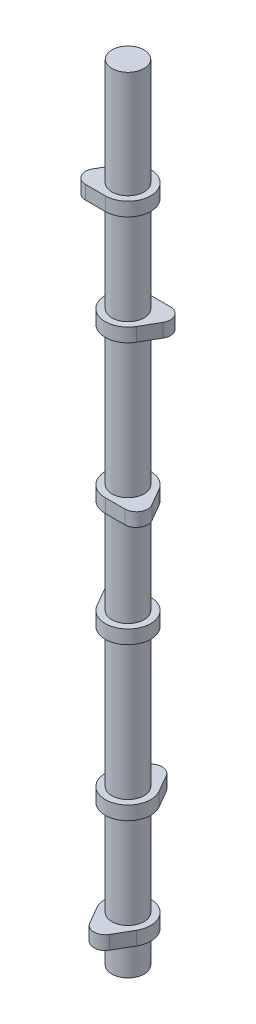
ISO-10303-21;
HEADER;
FILE_DESCRIPTION(('STEP AP214'),'2;1');
FILE_NAME('part.step','',(''),(''),'','','');
FILE_SCHEMA(('AUTOMOTIVE_DESIGN { 1 0 10303 214 1 1 1 1 }'));
ENDSEC;
DATA;
#1=APPLICATION_CONTEXT('core data for automotive mechanical design processes');
#2=APPLICATION_PROTOCOL_DEFINITION('international standard','automotive_design',2000,#1);
#3=PRODUCT_CONTEXT('',#1,'mechanical');
#4=PRODUCT('Part','Part','',(#3));
#5=PRODUCT_RELATED_PRODUCT_CATEGORY('part','',(#4));
#6=PRODUCT_DEFINITION_FORMATION('','',#4);
#7=PRODUCT_DEFINITION_CONTEXT('part definition',#1,'design');
#8=PRODUCT_DEFINITION('design','',#6,#7);
#9=PRODUCT_DEFINITION_SHAPE('','',#8);
#10=(LENGTH_UNIT() NAMED_UNIT(*) SI_UNIT(.MILLI.,.METRE.));
#11=(NAMED_UNIT(*) PLANE_ANGLE_UNIT() SI_UNIT($,.RADIAN.));
#12=(NAMED_UNIT(*) SI_UNIT($,.STERADIAN.) SOLID_ANGLE_UNIT());
#13=UNCERTAINTY_MEASURE_WITH_UNIT(LENGTH_MEASURE(1.E-05),#10,'distance_accuracy_value','');
#14=(GEOMETRIC_REPRESENTATION_CONTEXT(3) GLOBAL_UNCERTAINTY_ASSIGNED_CONTEXT((#13)) GLOBAL_UNIT_ASSIGNED_CONTEXT((#10,
#11,#12)) REPRESENTATION_CONTEXT('',''));
#15=CARTESIAN_POINT('',(0.,0.,0.));
#16=DIRECTION('',(0.,0.,1.));
#17=DIRECTION('',(1.,0.,0.));
#18=AXIS2_PLACEMENT_3D('',#15,#16,#17);
#19=CARTESIAN_POINT('',(-10.9985226280625,360.62,6.34999999999982));
#20=DIRECTION('',(0.,-1.,0.));
#21=DIRECTION('',(0.866025403784447,0.,-0.499999999999986));
#22=AXIS2_PLACEMENT_3D('',#19,#20,#21);
#23=CYLINDRICAL_SURFACE('',#22,6.35);
#24=CARTESIAN_POINT('',(-10.9985226280625,353.,6.34999999999982));
#25=DIRECTION('',(0.,1.,0.));
#26=DIRECTION('',(-0.866025403784447,0.,0.499999999999986));
#27=AXIS2_PLACEMENT_3D('',#24,#25,#26);
#28=CIRCLE('',#27,6.35);
#29=CARTESIAN_POINT('',(-16.4977839420936,353.,3.17499999999973));
#30=VERTEX_POINT('',#29);
#31=CARTESIAN_POINT('',(-10.9985226280626,353.,12.6999999999998));
#32=VERTEX_POINT('',#31);
#33=EDGE_CURVE('E466',#30,#32,#28,.T.);
#34=ORIENTED_EDGE('',*,*,#33,.T.);
#35=DIRECTION('',(0.,-1.,0.));
#36=VECTOR('',#35,1.);
#37=CARTESIAN_POINT('',(-10.9985226280626,360.62,12.6999999999998));
#38=LINE('',#37,#36);
#39=CARTESIAN_POINT('',(-10.9985226280626,360.62,12.6999999999998));
#40=VERTEX_POINT('',#39);
#41=EDGE_CURVE('E496',#40,#32,#38,.T.);
#42=ORIENTED_EDGE('',*,*,#41,.F.);
#43=CARTESIAN_POINT('',(-10.9985226280625,360.62,6.34999999999982));
#44=DIRECTION('',(0.,1.,0.));
#45=DIRECTION('',(-0.866025403784447,0.,0.499999999999986));
#46=AXIS2_PLACEMENT_3D('',#43,#44,#45);
#47=CIRCLE('',#46,6.35);
#48=CARTESIAN_POINT('',(-16.4977839420936,360.62,3.17499999999973));
#49=VERTEX_POINT('',#48);
#50=EDGE_CURVE('E467',#49,#40,#47,.T.);
#51=ORIENTED_EDGE('',*,*,#50,.F.);
#52=DIRECTION('',(0.,-1.,0.));
#53=VECTOR('',#52,1.);
#54=CARTESIAN_POINT('',(-16.4977839420936,360.62,3.17499999999973));
#55=LINE('',#54,#53);
#56=EDGE_CURVE('E477',#49,#30,#55,.T.);
#57=ORIENTED_EDGE('',*,*,#56,.T.);
#58=EDGE_LOOP('',(#34,#42,#51,#57));
#59=FACE_BOUND('',#58,.T.);
#60=ADVANCED_FACE('F47',(#59),#23,.T.);
#61=CARTESIAN_POINT('',(-10.9985226280626,360.62,12.6999999999998));
#62=DIRECTION('',(0.,0.,-1.));
#63=DIRECTION('',(-1.,0.,0.));
#64=AXIS2_PLACEMENT_3D('',#61,#62,#63);
#65=PLANE('',#64);
#66=DIRECTION('',(1.,0.,0.));
#67=VECTOR('',#66,1.);
#68=CARTESIAN_POINT('',(-10.9985226280626,353.,12.6999999999998));
#69=LINE('',#68,#67);
#70=CARTESIAN_POINT('',(-2.09034178855205E-13,353.,12.7));
#71=VERTEX_POINT('',#70);
#72=EDGE_CURVE('E481',#32,#71,#69,.T.);
#73=ORIENTED_EDGE('',*,*,#72,.T.);
#74=DIRECTION('',(0.,-1.,0.));
#75=VECTOR('',#74,1.);
#76=CARTESIAN_POINT('',(-2.09034178855205E-13,360.62,12.7));
#77=LINE('',#76,#75);
#78=CARTESIAN_POINT('',(-2.09034178855205E-13,360.62,12.7));
#79=VERTEX_POINT('',#78);
#80=EDGE_CURVE('E493',#79,#71,#77,.T.);
#81=ORIENTED_EDGE('',*,*,#80,.F.);
#82=DIRECTION('',(1.,0.,0.));
#83=VECTOR('',#82,1.);
#84=CARTESIAN_POINT('',(-10.9985226280626,360.62,12.6999999999998));
#85=LINE('',#84,#83);
#86=EDGE_CURVE('E97',#40,#79,#85,.T.);
#87=ORIENTED_EDGE('',*,*,#86,.F.);
#88=ORIENTED_EDGE('',*,*,#41,.T.);
#89=EDGE_LOOP('',(#73,#81,#87,#88));
#90=FACE_BOUND('',#89,.T.);
#91=ADVANCED_FACE('F517',(#90),#65,.F.);
#92=CARTESIAN_POINT('',(0.,360.62,0.));
#93=DIRECTION('',(0.,-1.,0.));
#94=DIRECTION('',(0.866025403784447,0.,-0.499999999999986));
#95=AXIS2_PLACEMENT_3D('',#92,#93,#94);
#96=CYLINDRICAL_SURFACE('',#95,12.7);
#97=CARTESIAN_POINT('',(0.,353.,0.));
#98=DIRECTION('',(0.,1.,0.));
#99=DIRECTION('',(-0.866025403784447,0.,0.499999999999986));
#100=AXIS2_PLACEMENT_3D('',#97,#98,#99);
#101=CIRCLE('',#100,12.7);
#102=CARTESIAN_POINT('',(-10.9985226280623,353.,-6.35000000000018));
#103=VERTEX_POINT('',#102);
#104=EDGE_CURVE('E83',#71,#103,#101,.T.);
#105=ORIENTED_EDGE('',*,*,#104,.T.);
#106=DIRECTION('',(0.,-1.,0.));
#107=VECTOR('',#106,1.);
#108=CARTESIAN_POINT('',(-10.9985226280623,360.62,-6.35000000000018));
#109=LINE('',#108,#107);
#110=CARTESIAN_POINT('',(-10.9985226280623,360.62,-6.35000000000018));
#111=VERTEX_POINT('',#110);
#112=EDGE_CURVE('E490',#111,#103,#109,.T.);
#113=ORIENTED_EDGE('',*,*,#112,.F.);
#114=CARTESIAN_POINT('',(0.,360.62,0.));
#115=DIRECTION('',(0.,1.,0.));
#116=DIRECTION('',(-0.866025403784447,0.,0.499999999999986));
#117=AXIS2_PLACEMENT_3D('',#114,#115,#116);
#118=CIRCLE('',#117,12.7);
#119=EDGE_CURVE('E472',#79,#111,#118,.T.);
#120=ORIENTED_EDGE('',*,*,#119,.F.);
#121=ORIENTED_EDGE('',*,*,#80,.T.);
#122=EDGE_LOOP('',(#105,#113,#120,#121));
#123=FACE_BOUND('',#122,.T.);
#124=ADVANCED_FACE('F516',(#123),#96,.T.);
#125=CARTESIAN_POINT('',(-16.4977839420936,360.62,3.17499999999973));
#126=DIRECTION('',(0.86602540378443,0.,0.500000000000014));
#127=DIRECTION('',(0.500000000000014,0.,-0.86602540378443));
#128=AXIS2_PLACEMENT_3D('',#125,#126,#127);
#129=PLANE('',#128);
#130=DIRECTION('',(-0.500000000000014,0.,0.86602540378443));
#131=VECTOR('',#130,1.);
#132=CARTESIAN_POINT('',(-16.4977839420936,353.,3.17499999999973));
#133=LINE('',#132,#131);
#134=EDGE_CURVE('E89',#103,#30,#133,.T.);
#135=ORIENTED_EDGE('',*,*,#134,.T.);
#136=ORIENTED_EDGE('',*,*,#56,.F.);
#137=DIRECTION('',(-0.500000000000014,0.,0.86602540378443));
#138=VECTOR('',#137,1.);
#139=CARTESIAN_POINT('',(-16.4977839420936,360.62,3.17499999999973));
#140=LINE('',#139,#138);
#141=EDGE_CURVE('E65',#111,#49,#140,.T.);
#142=ORIENTED_EDGE('',*,*,#141,.F.);
#143=ORIENTED_EDGE('',*,*,#112,.T.);
#144=EDGE_LOOP('',(#135,#136,#142,#143));
#145=FACE_BOUND('',#144,.T.);
#146=ADVANCED_FACE('F514',(#145),#129,.F.);
#147=CARTESIAN_POINT('',(-10.9985226280625,360.62,6.34999999999982));
#148=DIRECTION('',(0.,1.,0.));
#149=DIRECTION('',(-0.866025403784447,0.,0.499999999999986));
#150=AXIS2_PLACEMENT_3D('',#147,#148,#149);
#151=PLANE('',#150);
#152=CARTESIAN_POINT('',(0.,360.62,0.));
#153=DIRECTION('',(0.,1.,0.));
#154=DIRECTION('',(0.866025403784443,0.,-0.499999999999992));
#155=AXIS2_PLACEMENT_3D('',#152,#153,#154);
#156=CIRCLE('',#155,9.);
#157=CARTESIAN_POINT('',(7.79422863405999,360.62,-4.49999999999993));
#158=VERTEX_POINT('',#157);
#159=EDGE_CURVE('E462',#158,#158,#156,.F.);
#160=ORIENTED_EDGE('',*,*,#159,.T.);
#161=EDGE_LOOP('',(#160));
#162=FACE_BOUND('',#161,.T.);
#163=ORIENTED_EDGE('',*,*,#50,.T.);
#164=ORIENTED_EDGE('',*,*,#86,.T.);
#165=ORIENTED_EDGE('',*,*,#119,.T.);
#166=ORIENTED_EDGE('',*,*,#141,.T.);
#167=EDGE_LOOP('',(#163,#164,#165,#166));
#168=FACE_BOUND('',#167,.T.);
#169=ADVANCED_FACE('F508',(#162,#168),#151,.T.);
#170=CARTESIAN_POINT('',(-10.9985226280625,353.,6.34999999999982));
#171=DIRECTION('',(0.,1.,0.));
#172=DIRECTION('',(-0.866025403784447,0.,0.499999999999986));
#173=AXIS2_PLACEMENT_3D('',#170,#171,#172);
#174=PLANE('',#173);
#175=CARTESIAN_POINT('',(0.,353.,0.));
#176=DIRECTION('',(0.,1.,0.));
#177=DIRECTION('',(0.866025403784443,0.,-0.499999999999992));
#178=AXIS2_PLACEMENT_3D('',#175,#176,#177);
#179=CIRCLE('',#178,9.);
#180=CARTESIAN_POINT('',(7.79422863405999,353.,-4.49999999999993));
#181=VERTEX_POINT('',#180);
#182=EDGE_CURVE('E57',#181,#181,#179,.F.);
#183=ORIENTED_EDGE('',*,*,#182,.F.);
#184=EDGE_LOOP('',(#183));
#185=FACE_BOUND('',#184,.T.);
#186=ORIENTED_EDGE('',*,*,#33,.F.);
#187=ORIENTED_EDGE('',*,*,#134,.F.);
#188=ORIENTED_EDGE('',*,*,#104,.F.);
#189=ORIENTED_EDGE('',*,*,#72,.F.);
#190=EDGE_LOOP('',(#186,#187,#188,#189));
#191=FACE_BOUND('',#190,.T.);
#192=ADVANCED_FACE('F505',(#185,#191),#174,.F.);
#193=CARTESIAN_POINT('',(0.,420.37,0.));
#194=DIRECTION('',(0.,-1.,0.));
#195=DIRECTION('',(-0.866025403784443,0.,0.499999999999992));
#196=AXIS2_PLACEMENT_3D('',#193,#194,#195);
#197=CYLINDRICAL_SURFACE('',#196,9.);
#198=CARTESIAN_POINT('',(0.,299.72,0.));
#199=DIRECTION('',(0.,1.,0.));
#200=DIRECTION('',(0.866025403784443,0.,-0.499999999999992));
#201=AXIS2_PLACEMENT_3D('',#198,#199,#200);
#202=CIRCLE('',#201,9.);
#203=CARTESIAN_POINT('',(7.79422863405999,299.72,-4.49999999999993));
#204=VERTEX_POINT('',#203);
#205=EDGE_CURVE('E50',#204,#204,#202,.T.);
#206=ORIENTED_EDGE('',*,*,#205,.T.);
#207=EDGE_LOOP('',(#206));
#208=FACE_BOUND('',#207,.T.);
#209=ORIENTED_EDGE('',*,*,#182,.T.);
#210=EDGE_LOOP('',(#209));
#211=FACE_BOUND('',#210,.T.);
#212=ADVANCED_FACE('F503',(#208,#211),#197,.T.);
#213=ORIENTED_EDGE('',*,*,#159,.F.);
#214=EDGE_LOOP('',(#213));
#215=FACE_BOUND('',#214,.T.);
#216=CARTESIAN_POINT('',(0.,420.37,0.));
#217=DIRECTION('',(0.,1.,0.));
#218=DIRECTION('',(0.866025403784443,0.,-0.499999999999992));
#219=AXIS2_PLACEMENT_3D('',#216,#217,#218);
#220=CIRCLE('',#219,9.);
#221=CARTESIAN_POINT('',(7.79422863405999,420.37,-4.49999999999993));
#222=VERTEX_POINT('',#221);
#223=EDGE_CURVE('E458',#222,#222,#220,.T.);
#224=ORIENTED_EDGE('',*,*,#223,.F.);
#225=EDGE_LOOP('',(#224));
#226=FACE_BOUND('',#225,.T.);
#227=ADVANCED_FACE('F531',(#215,#226),#197,.T.);
#228=CARTESIAN_POINT('',(0.,420.37,0.));
#229=DIRECTION('',(0.,1.,0.));
#230=DIRECTION('',(0.866025403784443,0.,-0.499999999999992));
#231=AXIS2_PLACEMENT_3D('',#228,#229,#230);
#232=PLANE('',#231);
#233=ORIENTED_EDGE('',*,*,#223,.T.);
#234=EDGE_LOOP('',(#233));
#235=FACE_BOUND('',#234,.T.);
#236=ADVANCED_FACE('F534',(#235),#232,.T.);
#237=CARTESIAN_POINT('',(10.9985226280624,299.72,-6.3499999999999));
#238=DIRECTION('',(0.,-1.,0.));
#239=DIRECTION('',(-0.866025403784443,0.,0.499999999999992));
#240=AXIS2_PLACEMENT_3D('',#237,#238,#239);
#241=CYLINDRICAL_SURFACE('',#240,6.35);
#242=CARTESIAN_POINT('',(10.9985226280624,292.1,-6.3499999999999));
#243=DIRECTION('',(0.,1.,0.));
#244=DIRECTION('',(0.866025403784443,0.,-0.499999999999992));
#245=AXIS2_PLACEMENT_3D('',#242,#243,#244);
#246=CIRCLE('',#245,6.35);
#247=CARTESIAN_POINT('',(16.4977839420936,292.1,-3.17499999999985));
#248=VERTEX_POINT('',#247);
#249=CARTESIAN_POINT('',(10.9985226280625,292.1,-12.6999999999999));
#250=VERTEX_POINT('',#249);
#251=EDGE_CURVE('E413',#248,#250,#246,.T.);
#252=ORIENTED_EDGE('',*,*,#251,.T.);
#253=DIRECTION('',(0.,-1.,0.));
#254=VECTOR('',#253,1.);
#255=CARTESIAN_POINT('',(10.9985226280625,299.72,-12.6999999999999));
#256=LINE('',#255,#254);
#257=CARTESIAN_POINT('',(10.9985226280625,299.72,-12.6999999999999));
#258=VERTEX_POINT('',#257);
#259=EDGE_CURVE('E454',#258,#250,#256,.T.);
#260=ORIENTED_EDGE('',*,*,#259,.F.);
#261=CARTESIAN_POINT('',(10.9985226280624,299.72,-6.3499999999999));
#262=DIRECTION('',(0.,1.,0.));
#263=DIRECTION('',(0.866025403784443,0.,-0.499999999999992));
#264=AXIS2_PLACEMENT_3D('',#261,#262,#263);
#265=CIRCLE('',#264,6.35);
#266=CARTESIAN_POINT('',(16.4977839420936,299.72,-3.17499999999985));
#267=VERTEX_POINT('',#266);
#268=EDGE_CURVE('E417',#267,#258,#265,.T.);
#269=ORIENTED_EDGE('',*,*,#268,.F.);
#270=DIRECTION('',(0.,-1.,0.));
#271=VECTOR('',#270,1.);
#272=CARTESIAN_POINT('',(16.4977839420936,299.72,-3.17499999999985));
#273=LINE('',#272,#271);
#274=EDGE_CURVE('E431',#267,#248,#273,.T.);
#275=ORIENTED_EDGE('',*,*,#274,.T.);
#276=EDGE_LOOP('',(#252,#260,#269,#275));
#277=FACE_BOUND('',#276,.T.);
#278=ADVANCED_FACE('F539',(#277),#241,.T.);
#279=CARTESIAN_POINT('',(10.9985226280625,299.72,-12.6999999999999));
#280=DIRECTION('',(0.,0.,1.));
#281=DIRECTION('',(1.,0.,0.));
#282=AXIS2_PLACEMENT_3D('',#279,#280,#281);
#283=PLANE('',#282);
#284=DIRECTION('',(-1.,0.,0.));
#285=VECTOR('',#284,1.);
#286=CARTESIAN_POINT('',(10.9985226280625,292.1,-12.6999999999999));
#287=LINE('',#286,#285);
#288=CARTESIAN_POINT('',(1.196959198424E-13,292.1,-12.7));
#289=VERTEX_POINT('',#288);
#290=EDGE_CURVE('E435',#250,#289,#287,.T.);
#291=ORIENTED_EDGE('',*,*,#290,.T.);
#292=DIRECTION('',(0.,-1.,0.));
#293=VECTOR('',#292,1.);
#294=CARTESIAN_POINT('',(1.196959198424E-13,299.72,-12.7));
#295=LINE('',#294,#293);
#296=CARTESIAN_POINT('',(1.196959198424E-13,299.72,-12.7));
#297=VERTEX_POINT('',#296);
#298=EDGE_CURVE('E450',#297,#289,#295,.T.);
#299=ORIENTED_EDGE('',*,*,#298,.F.);
#300=DIRECTION('',(-1.,0.,0.));
#301=VECTOR('',#300,1.);
#302=CARTESIAN_POINT('',(10.9985226280625,299.72,-12.6999999999999));
#303=LINE('',#302,#301);
#304=EDGE_CURVE('E421',#258,#297,#303,.T.);
#305=ORIENTED_EDGE('',*,*,#304,.F.);
#306=ORIENTED_EDGE('',*,*,#259,.T.);
#307=EDGE_LOOP('',(#291,#299,#305,#306));
#308=FACE_BOUND('',#307,.T.);
#309=ADVANCED_FACE('F543',(#308),#283,.F.);
#310=CARTESIAN_POINT('',(0.,299.72,0.));
#311=DIRECTION('',(0.,-1.,0.));
#312=DIRECTION('',(-0.866025403784443,0.,0.499999999999992));
#313=AXIS2_PLACEMENT_3D('',#310,#311,#312);
#314=CYLINDRICAL_SURFACE('',#313,12.7);
#315=CARTESIAN_POINT('',(0.,292.1,0.));
#316=DIRECTION('',(0.,1.,0.));
#317=DIRECTION('',(0.866025403784443,0.,-0.499999999999992));
#318=AXIS2_PLACEMENT_3D('',#315,#316,#317);
#319=CIRCLE('',#318,12.7);
#320=CARTESIAN_POINT('',(10.9985226280623,292.1,6.3500000000001));
#321=VERTEX_POINT('',#320);
#322=EDGE_CURVE('E438',#289,#321,#319,.T.);
#323=ORIENTED_EDGE('',*,*,#322,.T.);
#324=DIRECTION('',(0.,-1.,0.));
#325=VECTOR('',#324,1.);
#326=CARTESIAN_POINT('',(10.9985226280623,299.72,6.3500000000001));
#327=LINE('',#326,#325);
#328=CARTESIAN_POINT('',(10.9985226280623,299.72,6.3500000000001));
#329=VERTEX_POINT('',#328);
#330=EDGE_CURVE('E446',#329,#321,#327,.T.);
#331=ORIENTED_EDGE('',*,*,#330,.F.);
#332=CARTESIAN_POINT('',(0.,299.72,0.));
#333=DIRECTION('',(0.,1.,0.));
#334=DIRECTION('',(0.866025403784443,0.,-0.499999999999992));
#335=AXIS2_PLACEMENT_3D('',#332,#333,#334);
#336=CIRCLE('',#335,12.7);
#337=EDGE_CURVE('E425',#297,#329,#336,.T.);
#338=ORIENTED_EDGE('',*,*,#337,.F.);
#339=ORIENTED_EDGE('',*,*,#298,.T.);
#340=EDGE_LOOP('',(#323,#331,#338,#339));
#341=FACE_BOUND('',#340,.T.);
#342=ADVANCED_FACE('F547',(#341),#314,.T.);
#343=CARTESIAN_POINT('',(16.4977839420936,299.72,-3.17499999999985));
#344=DIRECTION('',(-0.866025403784434,0.,-0.500000000000008));
#345=DIRECTION('',(-0.500000000000008,0.,0.866025403784434));
#346=AXIS2_PLACEMENT_3D('',#343,#344,#345);
#347=PLANE('',#346);
#348=DIRECTION('',(0.500000000000008,0.,-0.866025403784434));
#349=VECTOR('',#348,1.);
#350=CARTESIAN_POINT('',(16.4977839420936,292.1,-3.17499999999985));
#351=LINE('',#350,#349);
#352=EDGE_CURVE('E422',#321,#248,#351,.T.);
#353=ORIENTED_EDGE('',*,*,#352,.T.);
#354=ORIENTED_EDGE('',*,*,#274,.F.);
#355=DIRECTION('',(0.500000000000008,0.,-0.866025403784434));
#356=VECTOR('',#355,1.);
#357=CARTESIAN_POINT('',(16.4977839420936,299.72,-3.17499999999985));
#358=LINE('',#357,#356);
#359=EDGE_CURVE('E428',#329,#267,#358,.T.);
#360=ORIENTED_EDGE('',*,*,#359,.F.);
#361=ORIENTED_EDGE('',*,*,#330,.T.);
#362=EDGE_LOOP('',(#353,#354,#360,#361));
#363=FACE_BOUND('',#362,.T.);
#364=ADVANCED_FACE('F551',(#363),#347,.F.);
#365=CARTESIAN_POINT('',(10.9985226280624,299.72,-6.3499999999999));
#366=DIRECTION('',(0.,1.,0.));
#367=DIRECTION('',(0.866025403784443,0.,-0.499999999999992));
#368=AXIS2_PLACEMENT_3D('',#365,#366,#367);
#369=PLANE('',#368);
#370=ORIENTED_EDGE('',*,*,#205,.F.);
#371=EDGE_LOOP('',(#370));
#372=FACE_BOUND('',#371,.T.);
#373=ORIENTED_EDGE('',*,*,#268,.T.);
#374=ORIENTED_EDGE('',*,*,#304,.T.);
#375=ORIENTED_EDGE('',*,*,#337,.T.);
#376=ORIENTED_EDGE('',*,*,#359,.T.);
#377=EDGE_LOOP('',(#373,#374,#375,#376));
#378=FACE_BOUND('',#377,.T.);
#379=ADVANCED_FACE('F555',(#372,#378),#369,.T.);
#380=CARTESIAN_POINT('',(10.9985226280624,292.1,-6.3499999999999));
#381=DIRECTION('',(0.,1.,0.));
#382=DIRECTION('',(0.866025403784443,0.,-0.499999999999992));
#383=AXIS2_PLACEMENT_3D('',#380,#381,#382);
#384=PLANE('',#383);
#385=CARTESIAN_POINT('',(0.,292.1,0.));
#386=DIRECTION('',(0.,1.,0.));
#387=DIRECTION('',(0.866025403784443,0.,-0.499999999999992));
#388=AXIS2_PLACEMENT_3D('',#385,#386,#387);
#389=CIRCLE('',#388,9.);
#390=CARTESIAN_POINT('',(7.79422863405999,292.1,-4.49999999999993));
#391=VERTEX_POINT('',#390);
#392=EDGE_CURVE('E11',#391,#391,#389,.T.);
#393=ORIENTED_EDGE('',*,*,#392,.T.);
#394=EDGE_LOOP('',(#393));
#395=FACE_BOUND('',#394,.T.);
#396=ORIENTED_EDGE('',*,*,#251,.F.);
#397=ORIENTED_EDGE('',*,*,#352,.F.);
#398=ORIENTED_EDGE('',*,*,#322,.F.);
#399=ORIENTED_EDGE('',*,*,#290,.F.);
#400=EDGE_LOOP('',(#396,#397,#398,#399));
#401=FACE_BOUND('',#400,.T.);
#402=ADVANCED_FACE('F557',(#395,#401),#384,.F.);
#403=ORIENTED_EDGE('',*,*,#392,.F.);
#404=EDGE_LOOP('',(#403));
#405=FACE_BOUND('',#404,.T.);
#406=CARTESIAN_POINT('',(0.,214.57,0.));
#407=DIRECTION('',(0.,1.,0.));
#408=DIRECTION('',(-0.866025403784436,0.,-0.500000000000004));
#409=AXIS2_PLACEMENT_3D('',#406,#407,#408);
#410=CIRCLE('',#409,9.);
#411=CARTESIAN_POINT('',(-7.79422863405993,214.57,-4.50000000000004));
#412=VERTEX_POINT('',#411);
#413=EDGE_CURVE('E253',#412,#412,#410,.F.);
#414=ORIENTED_EDGE('',*,*,#413,.F.);
#415=EDGE_LOOP('',(#414));
#416=FACE_BOUND('',#415,.T.);
#417=ADVANCED_FACE('F536',(#405,#416),#197,.T.);
#418=CARTESIAN_POINT('',(0.,68.52,-12.7));
#419=DIRECTION('',(0.,-1.,0.));
#420=DIRECTION('',(0.,0.,1.));
#421=AXIS2_PLACEMENT_3D('',#418,#419,#420);
#422=CYLINDRICAL_SURFACE('',#421,6.35);
#423=CARTESIAN_POINT('',(0.,60.9,-12.7));
#424=DIRECTION('',(0.,1.,0.));
#425=DIRECTION('',(0.,0.,-1.));
#426=AXIS2_PLACEMENT_3D('',#423,#424,#425);
#427=CIRCLE('',#426,6.35);
#428=CARTESIAN_POINT('',(5.4992613140313,60.9,-15.875));
#429=VERTEX_POINT('',#428);
#430=CARTESIAN_POINT('',(-5.49926131403107,60.9,-15.875));
#431=VERTEX_POINT('',#430);
#432=EDGE_CURVE('E363',#429,#431,#427,.T.);
#433=ORIENTED_EDGE('',*,*,#432,.T.);
#434=DIRECTION('',(0.,-1.,0.));
#435=VECTOR('',#434,1.);
#436=CARTESIAN_POINT('',(-5.49926131403107,68.52,-15.875));
#437=LINE('',#436,#435);
#438=CARTESIAN_POINT('',(-5.49926131403107,68.52,-15.875));
#439=VERTEX_POINT('',#438);
#440=EDGE_CURVE('E401',#439,#431,#437,.T.);
#441=ORIENTED_EDGE('',*,*,#440,.F.);
#442=CARTESIAN_POINT('',(0.,68.52,-12.7));
#443=DIRECTION('',(0.,1.,0.));
#444=DIRECTION('',(0.,0.,-1.));
#445=AXIS2_PLACEMENT_3D('',#442,#443,#444);
#446=CIRCLE('',#445,6.35);
#447=CARTESIAN_POINT('',(5.4992613140313,68.52,-15.875));
#448=VERTEX_POINT('',#447);
#449=EDGE_CURVE('E364',#448,#439,#446,.T.);
#450=ORIENTED_EDGE('',*,*,#449,.F.);
#451=DIRECTION('',(0.,-1.,0.));
#452=VECTOR('',#451,1.);
#453=CARTESIAN_POINT('',(5.4992613140313,68.52,-15.875));
#454=LINE('',#453,#452);
#455=EDGE_CURVE('E378',#448,#429,#454,.T.);
#456=ORIENTED_EDGE('',*,*,#455,.T.);
#457=EDGE_LOOP('',(#433,#441,#450,#456));
#458=FACE_BOUND('',#457,.T.);
#459=ADVANCED_FACE('F564',(#458),#422,.T.);
#460=CARTESIAN_POINT('',(-5.49926131403107,68.52,-15.875));
#461=DIRECTION('',(0.866025403784435,0.,0.500000000000006));
#462=DIRECTION('',(0.500000000000006,0.,-0.866025403784435));
#463=AXIS2_PLACEMENT_3D('',#460,#461,#462);
#464=PLANE('',#463);
#465=DIRECTION('',(-0.500000000000006,0.,0.866025403784435));
#466=VECTOR('',#465,1.);
#467=CARTESIAN_POINT('',(-5.49926131403107,60.9,-15.875));
#468=LINE('',#467,#466);
#469=CARTESIAN_POINT('',(-10.9985226280623,60.9,-6.35000000000008));
#470=VERTEX_POINT('',#469);
#471=EDGE_CURVE('E382',#431,#470,#468,.T.);
#472=ORIENTED_EDGE('',*,*,#471,.T.);
#473=DIRECTION('',(0.,-1.,0.));
#474=VECTOR('',#473,1.);
#475=CARTESIAN_POINT('',(-10.9985226280623,68.52,-6.35000000000008));
#476=LINE('',#475,#474);
#477=CARTESIAN_POINT('',(-10.9985226280623,68.52,-6.35000000000008));
#478=VERTEX_POINT('',#477);
#479=EDGE_CURVE('E397',#478,#470,#476,.T.);
#480=ORIENTED_EDGE('',*,*,#479,.F.);
#481=DIRECTION('',(-0.500000000000006,0.,0.866025403784435));
#482=VECTOR('',#481,1.);
#483=CARTESIAN_POINT('',(-5.49926131403107,68.52,-15.875));
#484=LINE('',#483,#482);
#485=EDGE_CURVE('E368',#439,#478,#484,.T.);
#486=ORIENTED_EDGE('',*,*,#485,.F.);
#487=ORIENTED_EDGE('',*,*,#440,.T.);
#488=EDGE_LOOP('',(#472,#480,#486,#487));
#489=FACE_BOUND('',#488,.T.);
#490=ADVANCED_FACE('F567',(#489),#464,.F.);
#491=CARTESIAN_POINT('',(0.,68.52,0.));
#492=DIRECTION('',(0.,-1.,0.));
#493=DIRECTION('',(0.,0.,1.));
#494=AXIS2_PLACEMENT_3D('',#491,#492,#493);
#495=CYLINDRICAL_SURFACE('',#494,12.7);
#496=CARTESIAN_POINT('',(0.,60.9,0.));
#497=DIRECTION('',(0.,1.,0.));
#498=DIRECTION('',(0.,0.,-1.));
#499=AXIS2_PLACEMENT_3D('',#496,#497,#498);
#500=CIRCLE('',#499,12.7);
#501=CARTESIAN_POINT('',(10.9985226280624,60.9,-6.34999999999992));
#502=VERTEX_POINT('',#501);
#503=EDGE_CURVE('E385',#470,#502,#500,.T.);
#504=ORIENTED_EDGE('',*,*,#503,.T.);
#505=DIRECTION('',(0.,-1.,0.));
#506=VECTOR('',#505,1.);
#507=CARTESIAN_POINT('',(10.9985226280624,68.52,-6.34999999999992));
#508=LINE('',#507,#506);
#509=CARTESIAN_POINT('',(10.9985226280624,68.52,-6.34999999999992));
#510=VERTEX_POINT('',#509);
#511=EDGE_CURVE('E393',#510,#502,#508,.T.);
#512=ORIENTED_EDGE('',*,*,#511,.F.);
#513=CARTESIAN_POINT('',(0.,68.52,0.));
#514=DIRECTION('',(0.,1.,0.));
#515=DIRECTION('',(0.,0.,-1.));
#516=AXIS2_PLACEMENT_3D('',#513,#514,#515);
#517=CIRCLE('',#516,12.7);
#518=EDGE_CURVE('E372',#478,#510,#517,.T.);
#519=ORIENTED_EDGE('',*,*,#518,.F.);
#520=ORIENTED_EDGE('',*,*,#479,.T.);
#521=EDGE_LOOP('',(#504,#512,#519,#520));
#522=FACE_BOUND('',#521,.T.);
#523=ADVANCED_FACE('F571',(#522),#495,.T.);
#524=CARTESIAN_POINT('',(5.4992613140313,68.52,-15.875));
#525=DIRECTION('',(-0.866025403784442,0.,0.499999999999994));
#526=DIRECTION('',(0.499999999999994,0.,0.866025403784442));
#527=AXIS2_PLACEMENT_3D('',#524,#525,#526);
#528=PLANE('',#527);
#529=DIRECTION('',(-0.499999999999994,0.,-0.866025403784442));
#530=VECTOR('',#529,1.);
#531=CARTESIAN_POINT('',(5.4992613140313,60.9,-15.875));
#532=LINE('',#531,#530);
#533=EDGE_CURVE('E369',#502,#429,#532,.T.);
#534=ORIENTED_EDGE('',*,*,#533,.T.);
#535=ORIENTED_EDGE('',*,*,#455,.F.);
#536=DIRECTION('',(-0.499999999999994,0.,-0.866025403784442));
#537=VECTOR('',#536,1.);
#538=CARTESIAN_POINT('',(5.4992613140313,68.52,-15.875));
#539=LINE('',#538,#537);
#540=EDGE_CURVE('E375',#510,#448,#539,.T.);
#541=ORIENTED_EDGE('',*,*,#540,.F.);
#542=ORIENTED_EDGE('',*,*,#511,.T.);
#543=EDGE_LOOP('',(#534,#535,#541,#542));
#544=FACE_BOUND('',#543,.T.);
#545=ADVANCED_FACE('F575',(#544),#528,.F.);
#546=CARTESIAN_POINT('',(0.,68.52,-12.7));
#547=DIRECTION('',(0.,1.,0.));
#548=DIRECTION('',(0.,0.,-1.));
#549=AXIS2_PLACEMENT_3D('',#546,#547,#548);
#550=PLANE('',#549);
#551=CARTESIAN_POINT('',(0.,68.52,0.));
#552=DIRECTION('',(0.,1.,0.));
#553=DIRECTION('',(0.,0.,1.));
#554=AXIS2_PLACEMENT_3D('',#551,#552,#553);
#555=CIRCLE('',#554,9.);
#556=CARTESIAN_POINT('',(0.,68.52,9.));
#557=VERTEX_POINT('',#556);
#558=EDGE_CURVE('E359',#557,#557,#555,.F.);
#559=ORIENTED_EDGE('',*,*,#558,.T.);
#560=EDGE_LOOP('',(#559));
#561=FACE_BOUND('',#560,.T.);
#562=ORIENTED_EDGE('',*,*,#449,.T.);
#563=ORIENTED_EDGE('',*,*,#485,.T.);
#564=ORIENTED_EDGE('',*,*,#518,.T.);
#565=ORIENTED_EDGE('',*,*,#540,.T.);
#566=EDGE_LOOP('',(#562,#563,#564,#565));
#567=FACE_BOUND('',#566,.T.);
#568=ADVANCED_FACE('F579',(#561,#567),#550,.T.);
#569=CARTESIAN_POINT('',(0.,60.9,-12.7));
#570=DIRECTION('',(0.,1.,0.));
#571=DIRECTION('',(0.,0.,-1.));
#572=AXIS2_PLACEMENT_3D('',#569,#570,#571);
#573=PLANE('',#572);
#574=CARTESIAN_POINT('',(0.,60.9,0.));
#575=DIRECTION('',(0.,1.,0.));
#576=DIRECTION('',(0.,0.,1.));
#577=AXIS2_PLACEMENT_3D('',#574,#575,#576);
#578=CIRCLE('',#577,9.);
#579=CARTESIAN_POINT('',(0.,60.9,9.));
#580=VERTEX_POINT('',#579);
#581=EDGE_CURVE('E405',#580,#580,#578,.F.);
#582=ORIENTED_EDGE('',*,*,#581,.F.);
#583=EDGE_LOOP('',(#582));
#584=FACE_BOUND('',#583,.T.);
#585=ORIENTED_EDGE('',*,*,#432,.F.);
#586=ORIENTED_EDGE('',*,*,#533,.F.);
#587=ORIENTED_EDGE('',*,*,#503,.F.);
#588=ORIENTED_EDGE('',*,*,#471,.F.);
#589=EDGE_LOOP('',(#585,#586,#587,#588));
#590=FACE_BOUND('',#589,.T.);
#591=ADVANCED_FACE('F581',(#584,#590),#573,.F.);
#592=CARTESIAN_POINT('',(0.,128.27,0.));
#593=DIRECTION('',(0.,-1.,0.));
#594=DIRECTION('',(0.,0.,-1.));
#595=AXIS2_PLACEMENT_3D('',#592,#593,#594);
#596=CYLINDRICAL_SURFACE('',#595,9.);
#597=CARTESIAN_POINT('',(0.,7.62,0.));
#598=DIRECTION('',(0.,1.,0.));
#599=DIRECTION('',(0.,0.,1.));
#600=AXIS2_PLACEMENT_3D('',#597,#598,#599);
#601=CIRCLE('',#600,9.);
#602=CARTESIAN_POINT('',(0.,7.62,9.));
#603=VERTEX_POINT('',#602);
#604=EDGE_CURVE('E354',#603,#603,#601,.T.);
#605=ORIENTED_EDGE('',*,*,#604,.T.);
#606=EDGE_LOOP('',(#605));
#607=FACE_BOUND('',#606,.T.);
#608=ORIENTED_EDGE('',*,*,#581,.T.);
#609=EDGE_LOOP('',(#608));
#610=FACE_BOUND('',#609,.T.);
#611=ADVANCED_FACE('F584',(#607,#610),#596,.T.);
#612=ORIENTED_EDGE('',*,*,#558,.F.);
#613=EDGE_LOOP('',(#612));
#614=FACE_BOUND('',#613,.T.);
#615=CARTESIAN_POINT('',(0.,146.05,0.));
#616=DIRECTION('',(0.,1.,0.));
#617=DIRECTION('',(-0.866025403784436,0.,-0.500000000000004));
#618=AXIS2_PLACEMENT_3D('',#615,#616,#617);
#619=CIRCLE('',#618,9.);
#620=CARTESIAN_POINT('',(-7.79422863405993,146.05,-4.50000000000004));
#621=VERTEX_POINT('',#620);
#622=EDGE_CURVE('E308',#621,#621,#619,.T.);
#623=ORIENTED_EDGE('',*,*,#622,.F.);
#624=EDGE_LOOP('',(#623));
#625=FACE_BOUND('',#624,.T.);
#626=ADVANCED_FACE('F589',(#614,#625),#596,.T.);
#627=CARTESIAN_POINT('',(0.,7.62,12.7));
#628=DIRECTION('',(0.,-1.,0.));
#629=DIRECTION('',(0.,0.,-1.));
#630=AXIS2_PLACEMENT_3D('',#627,#628,#629);
#631=CYLINDRICAL_SURFACE('',#630,6.35);
#632=CARTESIAN_POINT('',(0.,0.,12.7));
#633=DIRECTION('',(0.,1.,0.));
#634=DIRECTION('',(0.,0.,1.));
#635=AXIS2_PLACEMENT_3D('',#632,#633,#634);
#636=CIRCLE('',#635,6.35);
#637=CARTESIAN_POINT('',(-5.49926131403118,0.,15.875));
#638=VERTEX_POINT('',#637);
#639=CARTESIAN_POINT('',(5.49926131403118,0.,15.875));
#640=VERTEX_POINT('',#639);
#641=EDGE_CURVE('E311',#638,#640,#636,.T.);
#642=ORIENTED_EDGE('',*,*,#641,.T.);
#643=DIRECTION('',(0.,-1.,0.));
#644=VECTOR('',#643,1.);
#645=CARTESIAN_POINT('',(5.49926131403118,7.62,15.875));
#646=LINE('',#645,#644);
#647=CARTESIAN_POINT('',(5.49926131403118,7.62,15.875));
#648=VERTEX_POINT('',#647);
#649=EDGE_CURVE('E350',#648,#640,#646,.T.);
#650=ORIENTED_EDGE('',*,*,#649,.F.);
#651=CARTESIAN_POINT('',(0.,7.62,12.7));
#652=DIRECTION('',(0.,1.,0.));
#653=DIRECTION('',(0.,0.,1.));
#654=AXIS2_PLACEMENT_3D('',#651,#652,#653);
#655=CIRCLE('',#654,6.35);
#656=CARTESIAN_POINT('',(-5.49926131403118,7.62,15.875));
#657=VERTEX_POINT('',#656);
#658=EDGE_CURVE('E313',#657,#648,#655,.T.);
#659=ORIENTED_EDGE('',*,*,#658,.F.);
#660=DIRECTION('',(0.,-1.,0.));
#661=VECTOR('',#660,1.);
#662=CARTESIAN_POINT('',(-5.49926131403118,7.62,15.875));
#663=LINE('',#662,#661);
#664=EDGE_CURVE('E327',#657,#638,#663,.T.);
#665=ORIENTED_EDGE('',*,*,#664,.T.);
#666=EDGE_LOOP('',(#642,#650,#659,#665));
#667=FACE_BOUND('',#666,.T.);
#668=ADVANCED_FACE('F592',(#667),#631,.T.);
#669=CARTESIAN_POINT('',(5.49926131403118,7.62,15.875));
#670=DIRECTION('',(-0.866025403784439,0.,-0.5));
#671=DIRECTION('',(-0.5,0.,0.866025403784439));
#672=AXIS2_PLACEMENT_3D('',#669,#670,#671);
#673=PLANE('',#672);
#674=DIRECTION('',(0.5,0.,-0.866025403784439));
#675=VECTOR('',#674,1.);
#676=CARTESIAN_POINT('',(5.49926131403118,0.,15.875));
#677=LINE('',#676,#675);
#678=CARTESIAN_POINT('',(10.9985226280624,0.,6.35));
#679=VERTEX_POINT('',#678);
#680=EDGE_CURVE('E331',#640,#679,#677,.T.);
#681=ORIENTED_EDGE('',*,*,#680,.T.);
#682=DIRECTION('',(0.,-1.,0.));
#683=VECTOR('',#682,1.);
#684=CARTESIAN_POINT('',(10.9985226280624,7.62,6.35));
#685=LINE('',#684,#683);
#686=CARTESIAN_POINT('',(10.9985226280624,7.62,6.35));
#687=VERTEX_POINT('',#686);
#688=EDGE_CURVE('E346',#687,#679,#685,.T.);
#689=ORIENTED_EDGE('',*,*,#688,.F.);
#690=DIRECTION('',(0.5,0.,-0.866025403784439));
#691=VECTOR('',#690,1.);
#692=CARTESIAN_POINT('',(5.49926131403118,7.62,15.875));
#693=LINE('',#692,#691);
#694=EDGE_CURVE('E317',#648,#687,#693,.T.);
#695=ORIENTED_EDGE('',*,*,#694,.F.);
#696=ORIENTED_EDGE('',*,*,#649,.T.);
#697=EDGE_LOOP('',(#681,#689,#695,#696));
#698=FACE_BOUND('',#697,.T.);
#699=ADVANCED_FACE('F602',(#698),#673,.F.);
#700=CARTESIAN_POINT('',(0.,7.62,0.));
#701=DIRECTION('',(0.,-1.,0.));
#702=DIRECTION('',(0.,0.,-1.));
#703=AXIS2_PLACEMENT_3D('',#700,#701,#702);
#704=CYLINDRICAL_SURFACE('',#703,12.7);
#705=CARTESIAN_POINT('',(0.,0.,0.));
#706=DIRECTION('',(0.,1.,0.));
#707=DIRECTION('',(0.,0.,1.));
#708=AXIS2_PLACEMENT_3D('',#705,#706,#707);
#709=CIRCLE('',#708,12.7);
#710=CARTESIAN_POINT('',(-10.9985226280624,0.,6.35));
#711=VERTEX_POINT('',#710);
#712=EDGE_CURVE('E334',#679,#711,#709,.T.);
#713=ORIENTED_EDGE('',*,*,#712,.T.);
#714=DIRECTION('',(0.,-1.,0.));
#715=VECTOR('',#714,1.);
#716=CARTESIAN_POINT('',(-10.9985226280624,7.62,6.35));
#717=LINE('',#716,#715);
#718=CARTESIAN_POINT('',(-10.9985226280624,7.62,6.35));
#719=VERTEX_POINT('',#718);
#720=EDGE_CURVE('E342',#719,#711,#717,.T.);
#721=ORIENTED_EDGE('',*,*,#720,.F.);
#722=CARTESIAN_POINT('',(0.,7.62,0.));
#723=DIRECTION('',(0.,1.,0.));
#724=DIRECTION('',(0.,0.,1.));
#725=AXIS2_PLACEMENT_3D('',#722,#723,#724);
#726=CIRCLE('',#725,12.7);
#727=EDGE_CURVE('E321',#687,#719,#726,.T.);
#728=ORIENTED_EDGE('',*,*,#727,.F.);
#729=ORIENTED_EDGE('',*,*,#688,.T.);
#730=EDGE_LOOP('',(#713,#721,#728,#729));
#731=FACE_BOUND('',#730,.T.);
#732=ADVANCED_FACE('F606',(#731),#704,.T.);
#733=CARTESIAN_POINT('',(-5.49926131403118,7.62,15.875));
#734=DIRECTION('',(0.866025403784439,0.,-0.5));
#735=DIRECTION('',(-0.5,0.,-0.866025403784439));
#736=AXIS2_PLACEMENT_3D('',#733,#734,#735);
#737=PLANE('',#736);
#738=DIRECTION('',(0.5,0.,0.866025403784439));
#739=VECTOR('',#738,1.);
#740=CARTESIAN_POINT('',(-5.49926131403118,0.,15.875));
#741=LINE('',#740,#739);
#742=EDGE_CURVE('E318',#711,#638,#741,.T.);
#743=ORIENTED_EDGE('',*,*,#742,.T.);
#744=ORIENTED_EDGE('',*,*,#664,.F.);
#745=DIRECTION('',(0.5,0.,0.866025403784439));
#746=VECTOR('',#745,1.);
#747=CARTESIAN_POINT('',(-5.49926131403118,7.62,15.875));
#748=LINE('',#747,#746);
#749=EDGE_CURVE('E324',#719,#657,#748,.T.);
#750=ORIENTED_EDGE('',*,*,#749,.F.);
#751=ORIENTED_EDGE('',*,*,#720,.T.);
#752=EDGE_LOOP('',(#743,#744,#750,#751));
#753=FACE_BOUND('',#752,.T.);
#754=ADVANCED_FACE('F610',(#753),#737,.F.);
#755=CARTESIAN_POINT('',(0.,7.62,12.7));
#756=DIRECTION('',(0.,1.,0.));
#757=DIRECTION('',(0.,0.,1.));
#758=AXIS2_PLACEMENT_3D('',#755,#756,#757);
#759=PLANE('',#758);
#760=ORIENTED_EDGE('',*,*,#604,.F.);
#761=EDGE_LOOP('',(#760));
#762=FACE_BOUND('',#761,.T.);
#763=ORIENTED_EDGE('',*,*,#658,.T.);
#764=ORIENTED_EDGE('',*,*,#694,.T.);
#765=ORIENTED_EDGE('',*,*,#727,.T.);
#766=ORIENTED_EDGE('',*,*,#749,.T.);
#767=EDGE_LOOP('',(#763,#764,#765,#766));
#768=FACE_BOUND('',#767,.T.);
#769=ADVANCED_FACE('F614',(#762,#768),#759,.T.);
#770=CARTESIAN_POINT('',(0.,0.,12.7));
#771=DIRECTION('',(0.,1.,0.));
#772=DIRECTION('',(0.,0.,1.));
#773=AXIS2_PLACEMENT_3D('',#770,#771,#772);
#774=PLANE('',#773);
#775=CARTESIAN_POINT('',(0.,0.,0.));
#776=DIRECTION('',(0.,1.,0.));
#777=DIRECTION('',(0.,0.,1.));
#778=AXIS2_PLACEMENT_3D('',#775,#776,#777);
#779=CIRCLE('',#778,9.);
#780=CARTESIAN_POINT('',(0.,0.,9.));
#781=VERTEX_POINT('',#780);
#782=EDGE_CURVE('E409',#781,#781,#779,.T.);
#783=ORIENTED_EDGE('',*,*,#782,.T.);
#784=EDGE_LOOP('',(#783));
#785=FACE_BOUND('',#784,.T.);
#786=ORIENTED_EDGE('',*,*,#641,.F.);
#787=ORIENTED_EDGE('',*,*,#742,.F.);
#788=ORIENTED_EDGE('',*,*,#712,.F.);
#789=ORIENTED_EDGE('',*,*,#680,.F.);
#790=EDGE_LOOP('',(#786,#787,#788,#789));
#791=FACE_BOUND('',#790,.T.);
#792=ADVANCED_FACE('F598',(#785,#791),#774,.F.);
#793=CARTESIAN_POINT('',(0.,-17.78,0.));
#794=DIRECTION('',(0.,1.,0.));
#795=DIRECTION('',(0.,0.,1.));
#796=AXIS2_PLACEMENT_3D('',#793,#794,#795);
#797=PLANE('',#796);
#798=CARTESIAN_POINT('',(0.,-17.78,0.));
#799=DIRECTION('',(0.,1.,0.));
#800=DIRECTION('',(0.,0.,1.));
#801=AXIS2_PLACEMENT_3D('',#798,#799,#800);
#802=CIRCLE('',#801,9.);
#803=CARTESIAN_POINT('',(0.,-17.78,9.));
#804=VERTEX_POINT('',#803);
#805=EDGE_CURVE('E355',#804,#804,#802,.T.);
#806=ORIENTED_EDGE('',*,*,#805,.F.);
#807=EDGE_LOOP('',(#806));
#808=FACE_BOUND('',#807,.T.);
#809=ADVANCED_FACE('F595',(#808),#797,.F.);
#810=ORIENTED_EDGE('',*,*,#805,.T.);
#811=EDGE_LOOP('',(#810));
#812=FACE_BOUND('',#811,.T.);
#813=ORIENTED_EDGE('',*,*,#782,.F.);
#814=EDGE_LOOP('',(#813));
#815=FACE_BOUND('',#814,.T.);
#816=ADVANCED_FACE('F594',(#812,#815),#596,.T.);
#817=CARTESIAN_POINT('',(10.9985226280623,214.57,6.35000000000013));
#818=DIRECTION('',(0.,-1.,0.));
#819=DIRECTION('',(-0.866025403784433,0.,-0.50000000000001));
#820=AXIS2_PLACEMENT_3D('',#817,#818,#819);
#821=CYLINDRICAL_SURFACE('',#820,6.35);
#822=CARTESIAN_POINT('',(10.9985226280623,206.95,6.35000000000013));
#823=DIRECTION('',(0.,1.,0.));
#824=DIRECTION('',(0.866025403784433,0.,0.50000000000001));
#825=AXIS2_PLACEMENT_3D('',#822,#823,#824);
#826=CIRCLE('',#825,6.35);
#827=CARTESIAN_POINT('',(10.9985226280622,206.95,12.7000000000001));
#828=VERTEX_POINT('',#827);
#829=CARTESIAN_POINT('',(16.4977839420935,206.95,3.17500000000019));
#830=VERTEX_POINT('',#829);
#831=EDGE_CURVE('E262',#828,#830,#826,.T.);
#832=ORIENTED_EDGE('',*,*,#831,.T.);
#833=DIRECTION('',(0.,-1.,0.));
#834=VECTOR('',#833,1.);
#835=CARTESIAN_POINT('',(16.4977839420935,214.57,3.17500000000019));
#836=LINE('',#835,#834);
#837=CARTESIAN_POINT('',(16.4977839420935,214.57,3.17500000000019));
#838=VERTEX_POINT('',#837);
#839=EDGE_CURVE('E300',#838,#830,#836,.T.);
#840=ORIENTED_EDGE('',*,*,#839,.F.);
#841=CARTESIAN_POINT('',(10.9985226280623,214.57,6.35000000000013));
#842=DIRECTION('',(0.,1.,0.));
#843=DIRECTION('',(0.866025403784433,0.,0.50000000000001));
#844=AXIS2_PLACEMENT_3D('',#841,#842,#843);
#845=CIRCLE('',#844,6.35);
#846=CARTESIAN_POINT('',(10.9985226280622,214.57,12.7000000000001));
#847=VERTEX_POINT('',#846);
#848=EDGE_CURVE('E263',#847,#838,#845,.T.);
#849=ORIENTED_EDGE('',*,*,#848,.F.);
#850=DIRECTION('',(0.,-1.,0.));
#851=VECTOR('',#850,1.);
#852=CARTESIAN_POINT('',(10.9985226280622,214.57,12.7000000000001));
#853=LINE('',#852,#851);
#854=EDGE_CURVE('E277',#847,#828,#853,.T.);
#855=ORIENTED_EDGE('',*,*,#854,.T.);
#856=EDGE_LOOP('',(#832,#840,#849,#855));
#857=FACE_BOUND('',#856,.T.);
#858=ADVANCED_FACE('F622',(#857),#821,.T.);
#859=CARTESIAN_POINT('',(16.4977839420935,214.57,3.17500000000019));
#860=DIRECTION('',(-0.866025403784445,0.,0.49999999999999));
#861=DIRECTION('',(0.49999999999999,0.,0.866025403784445));
#862=AXIS2_PLACEMENT_3D('',#859,#860,#861);
#863=PLANE('',#862);
#864=DIRECTION('',(-0.49999999999999,0.,-0.866025403784445));
#865=VECTOR('',#864,1.);
#866=CARTESIAN_POINT('',(16.4977839420935,206.95,3.17500000000019));
#867=LINE('',#866,#865);
#868=CARTESIAN_POINT('',(10.9985226280624,206.95,-6.34999999999987));
#869=VERTEX_POINT('',#868);
#870=EDGE_CURVE('E281',#830,#869,#867,.T.);
#871=ORIENTED_EDGE('',*,*,#870,.T.);
#872=DIRECTION('',(0.,-1.,0.));
#873=VECTOR('',#872,1.);
#874=CARTESIAN_POINT('',(10.9985226280624,214.57,-6.34999999999987));
#875=LINE('',#874,#873);
#876=CARTESIAN_POINT('',(10.9985226280624,214.57,-6.34999999999987));
#877=VERTEX_POINT('',#876);
#878=EDGE_CURVE('E296',#877,#869,#875,.T.);
#879=ORIENTED_EDGE('',*,*,#878,.F.);
#880=DIRECTION('',(-0.49999999999999,0.,-0.866025403784445));
#881=VECTOR('',#880,1.);
#882=CARTESIAN_POINT('',(16.4977839420935,214.57,3.17500000000019));
#883=LINE('',#882,#881);
#884=EDGE_CURVE('E267',#838,#877,#883,.T.);
#885=ORIENTED_EDGE('',*,*,#884,.F.);
#886=ORIENTED_EDGE('',*,*,#839,.T.);
#887=EDGE_LOOP('',(#871,#879,#885,#886));
#888=FACE_BOUND('',#887,.T.);
#889=ADVANCED_FACE('F625',(#888),#863,.F.);
#890=CARTESIAN_POINT('',(0.,214.57,0.));
#891=DIRECTION('',(0.,-1.,0.));
#892=DIRECTION('',(-0.866025403784433,0.,-0.50000000000001));
#893=AXIS2_PLACEMENT_3D('',#890,#891,#892);
#894=CYLINDRICAL_SURFACE('',#893,12.7);
#895=CARTESIAN_POINT('',(0.,206.95,0.));
#896=DIRECTION('',(0.,1.,0.));
#897=DIRECTION('',(0.866025403784433,0.,0.50000000000001));
#898=AXIS2_PLACEMENT_3D('',#895,#896,#897);
#899=CIRCLE('',#898,12.7);
#900=CARTESIAN_POINT('',(-1.4658413372004E-13,206.95,12.7));
#901=VERTEX_POINT('',#900);
#902=EDGE_CURVE('E284',#869,#901,#899,.T.);
#903=ORIENTED_EDGE('',*,*,#902,.T.);
#904=DIRECTION('',(0.,-1.,0.));
#905=VECTOR('',#904,1.);
#906=CARTESIAN_POINT('',(-1.4658413372004E-13,214.57,12.7));
#907=LINE('',#906,#905);
#908=CARTESIAN_POINT('',(-1.4658413372004E-13,214.57,12.7));
#909=VERTEX_POINT('',#908);
#910=EDGE_CURVE('E292',#909,#901,#907,.T.);
#911=ORIENTED_EDGE('',*,*,#910,.F.);
#912=CARTESIAN_POINT('',(0.,214.57,0.));
#913=DIRECTION('',(0.,1.,0.));
#914=DIRECTION('',(0.866025403784433,0.,0.50000000000001));
#915=AXIS2_PLACEMENT_3D('',#912,#913,#914);
#916=CIRCLE('',#915,12.7);
#917=EDGE_CURVE('E271',#877,#909,#916,.T.);
#918=ORIENTED_EDGE('',*,*,#917,.F.);
#919=ORIENTED_EDGE('',*,*,#878,.T.);
#920=EDGE_LOOP('',(#903,#911,#918,#919));
#921=FACE_BOUND('',#920,.T.);
#922=ADVANCED_FACE('F629',(#921),#894,.T.);
#923=CARTESIAN_POINT('',(10.9985226280622,214.57,12.7000000000001));
#924=DIRECTION('',(0.,0.,-1.));
#925=DIRECTION('',(-1.,0.,0.));
#926=AXIS2_PLACEMENT_3D('',#923,#924,#925);
#927=PLANE('',#926);
#928=DIRECTION('',(1.,0.,0.));
#929=VECTOR('',#928,1.);
#930=CARTESIAN_POINT('',(10.9985226280622,206.95,12.7000000000001));
#931=LINE('',#930,#929);
#932=EDGE_CURVE('E268',#901,#828,#931,.T.);
#933=ORIENTED_EDGE('',*,*,#932,.T.);
#934=ORIENTED_EDGE('',*,*,#854,.F.);
#935=DIRECTION('',(1.,0.,0.));
#936=VECTOR('',#935,1.);
#937=CARTESIAN_POINT('',(10.9985226280622,214.57,12.7000000000001));
#938=LINE('',#937,#936);
#939=EDGE_CURVE('E274',#909,#847,#938,.T.);
#940=ORIENTED_EDGE('',*,*,#939,.F.);
#941=ORIENTED_EDGE('',*,*,#910,.T.);
#942=EDGE_LOOP('',(#933,#934,#940,#941));
#943=FACE_BOUND('',#942,.T.);
#944=ADVANCED_FACE('F633',(#943),#927,.F.);
#945=CARTESIAN_POINT('',(10.9985226280623,214.57,6.35000000000013));
#946=DIRECTION('',(0.,1.,0.));
#947=DIRECTION('',(0.866025403784433,0.,0.50000000000001));
#948=AXIS2_PLACEMENT_3D('',#945,#946,#947);
#949=PLANE('',#948);
#950=ORIENTED_EDGE('',*,*,#413,.T.);
#951=EDGE_LOOP('',(#950));
#952=FACE_BOUND('',#951,.T.);
#953=ORIENTED_EDGE('',*,*,#848,.T.);
#954=ORIENTED_EDGE('',*,*,#884,.T.);
#955=ORIENTED_EDGE('',*,*,#917,.T.);
#956=ORIENTED_EDGE('',*,*,#939,.T.);
#957=EDGE_LOOP('',(#953,#954,#955,#956));
#958=FACE_BOUND('',#957,.T.);
#959=ADVANCED_FACE('F637',(#952,#958),#949,.T.);
#960=CARTESIAN_POINT('',(10.9985226280623,206.95,6.35000000000013));
#961=DIRECTION('',(0.,1.,0.));
#962=DIRECTION('',(0.866025403784433,0.,0.50000000000001));
#963=AXIS2_PLACEMENT_3D('',#960,#961,#962);
#964=PLANE('',#963);
#965=CARTESIAN_POINT('',(0.,206.95,0.));
#966=DIRECTION('',(0.,1.,0.));
#967=DIRECTION('',(-0.866025403784436,0.,-0.500000000000004));
#968=AXIS2_PLACEMENT_3D('',#965,#966,#967);
#969=CIRCLE('',#968,9.);
#970=CARTESIAN_POINT('',(-7.79422863405993,206.95,-4.50000000000004));
#971=VERTEX_POINT('',#970);
#972=EDGE_CURVE('E304',#971,#971,#969,.F.);
#973=ORIENTED_EDGE('',*,*,#972,.F.);
#974=EDGE_LOOP('',(#973));
#975=FACE_BOUND('',#974,.T.);
#976=ORIENTED_EDGE('',*,*,#831,.F.);
#977=ORIENTED_EDGE('',*,*,#932,.F.);
#978=ORIENTED_EDGE('',*,*,#902,.F.);
#979=ORIENTED_EDGE('',*,*,#870,.F.);
#980=EDGE_LOOP('',(#976,#977,#978,#979));
#981=FACE_BOUND('',#980,.T.);
#982=ADVANCED_FACE('F639',(#975,#981),#964,.F.);
#983=CARTESIAN_POINT('',(0.,274.32,0.));
#984=DIRECTION('',(0.,-1.,0.));
#985=DIRECTION('',(0.866025403784436,0.,0.500000000000004));
#986=AXIS2_PLACEMENT_3D('',#983,#984,#985);
#987=CYLINDRICAL_SURFACE('',#986,9.);
#988=CARTESIAN_POINT('',(0.,153.67,0.));
#989=DIRECTION('',(0.,1.,0.));
#990=DIRECTION('',(-0.866025403784436,0.,-0.500000000000004));
#991=AXIS2_PLACEMENT_3D('',#988,#989,#990);
#992=CIRCLE('',#991,9.);
#993=CARTESIAN_POINT('',(-7.79422863405993,153.67,-4.50000000000004));
#994=VERTEX_POINT('',#993);
#995=EDGE_CURVE('E248',#994,#994,#992,.T.);
#996=ORIENTED_EDGE('',*,*,#995,.T.);
#997=EDGE_LOOP('',(#996));
#998=FACE_BOUND('',#997,.T.);
#999=ORIENTED_EDGE('',*,*,#972,.T.);
#1000=EDGE_LOOP('',(#999));
#1001=FACE_BOUND('',#1000,.T.);
#1002=ADVANCED_FACE('F642',(#998,#1001),#987,.T.);
#1003=CARTESIAN_POINT('',(-10.9985226280623,153.67,-6.35000000000005));
#1004=DIRECTION('',(0.,-1.,0.));
#1005=DIRECTION('',(0.866025403784436,0.,0.500000000000004));
#1006=AXIS2_PLACEMENT_3D('',#1003,#1004,#1005);
#1007=CYLINDRICAL_SURFACE('',#1006,6.35);
#1008=CARTESIAN_POINT('',(-10.9985226280623,146.05,-6.35000000000005));
#1009=DIRECTION('',(0.,1.,0.));
#1010=DIRECTION('',(-0.866025403784436,0.,-0.500000000000004));
#1011=AXIS2_PLACEMENT_3D('',#1008,#1009,#1010);
#1012=CIRCLE('',#1011,6.35);
#1013=CARTESIAN_POINT('',(-10.9985226280623,146.05,-12.7000000000001));
#1014=VERTEX_POINT('',#1013);
#1015=CARTESIAN_POINT('',(-16.4977839420935,146.05,-3.17500000000008));
#1016=VERTEX_POINT('',#1015);
#1017=EDGE_CURVE('E246',#1014,#1016,#1012,.T.);
#1018=ORIENTED_EDGE('',*,*,#1017,.T.);
#1019=DIRECTION('',(0.,-1.,0.));
#1020=VECTOR('',#1019,1.);
#1021=CARTESIAN_POINT('',(-16.4977839420935,153.67,-3.17500000000008));
#1022=LINE('',#1021,#1020);
#1023=CARTESIAN_POINT('',(-16.4977839420935,153.67,-3.17500000000008));
#1024=VERTEX_POINT('',#1023);
#1025=EDGE_CURVE('E224',#1024,#1016,#1022,.T.);
#1026=ORIENTED_EDGE('',*,*,#1025,.F.);
#1027=CARTESIAN_POINT('',(-10.9985226280623,153.67,-6.35000000000005));
#1028=DIRECTION('',(0.,1.,0.));
#1029=DIRECTION('',(-0.866025403784436,0.,-0.500000000000004));
#1030=AXIS2_PLACEMENT_3D('',#1027,#1028,#1029);
#1031=CIRCLE('',#1030,6.35);
#1032=CARTESIAN_POINT('',(-10.9985226280623,153.67,-12.7000000000001));
#1033=VERTEX_POINT('',#1032);
#1034=EDGE_CURVE('E232',#1033,#1024,#1031,.T.);
#1035=ORIENTED_EDGE('',*,*,#1034,.F.);
#1036=DIRECTION('',(0.,-1.,0.));
#1037=VECTOR('',#1036,1.);
#1038=CARTESIAN_POINT('',(-10.9985226280623,153.67,-12.7000000000001));
#1039=LINE('',#1038,#1037);
#1040=EDGE_CURVE('E1059',#1033,#1014,#1039,.T.);
#1041=ORIENTED_EDGE('',*,*,#1040,.T.);
#1042=EDGE_LOOP('',(#1018,#1026,#1035,#1041));
#1043=FACE_BOUND('',#1042,.T.);
#1044=ADVANCED_FACE('F244',(#1043),#1007,.T.);
#1045=CARTESIAN_POINT('',(-16.4977839420935,153.67,-3.17500000000008));
#1046=DIRECTION('',(0.866025403784441,0.,-0.499999999999996));
#1047=DIRECTION('',(-0.499999999999996,0.,-0.866025403784441));
#1048=AXIS2_PLACEMENT_3D('',#1045,#1046,#1047);
#1049=PLANE('',#1048);
#1050=DIRECTION('',(0.499999999999996,0.,0.866025403784441));
#1051=VECTOR('',#1050,1.);
#1052=CARTESIAN_POINT('',(-16.4977839420935,146.05,-3.17500000000008));
#1053=LINE('',#1052,#1051);
#1054=CARTESIAN_POINT('',(-10.9985226280624,146.05,6.34999999999995));
#1055=VERTEX_POINT('',#1054);
#1056=EDGE_CURVE('E1046',#1016,#1055,#1053,.T.);
#1057=ORIENTED_EDGE('',*,*,#1056,.T.);
#1058=DIRECTION('',(0.,-1.,0.));
#1059=VECTOR('',#1058,1.);
#1060=CARTESIAN_POINT('',(-10.9985226280624,153.67,6.34999999999995));
#1061=LINE('',#1060,#1059);
#1062=CARTESIAN_POINT('',(-10.9985226280624,153.67,6.34999999999995));
#1063=VERTEX_POINT('',#1062);
#1064=EDGE_CURVE('E227',#1063,#1055,#1061,.T.);
#1065=ORIENTED_EDGE('',*,*,#1064,.F.);
#1066=DIRECTION('',(0.499999999999996,0.,0.866025403784441));
#1067=VECTOR('',#1066,1.);
#1068=CARTESIAN_POINT('',(-16.4977839420935,153.67,-3.17500000000008));
#1069=LINE('',#1068,#1067);
#1070=EDGE_CURVE('E220',#1024,#1063,#1069,.T.);
#1071=ORIENTED_EDGE('',*,*,#1070,.F.);
#1072=ORIENTED_EDGE('',*,*,#1025,.T.);
#1073=EDGE_LOOP('',(#1057,#1065,#1071,#1072));
#1074=FACE_BOUND('',#1073,.T.);
#1075=ADVANCED_FACE('F222',(#1074),#1049,.F.);
#1076=CARTESIAN_POINT('',(0.,153.67,0.));
#1077=DIRECTION('',(0.,-1.,0.));
#1078=DIRECTION('',(0.866025403784436,0.,0.500000000000004));
#1079=AXIS2_PLACEMENT_3D('',#1076,#1077,#1078);
#1080=CYLINDRICAL_SURFACE('',#1079,12.7);
#1081=CARTESIAN_POINT('',(0.,146.05,0.));
#1082=DIRECTION('',(0.,1.,0.));
#1083=DIRECTION('',(-0.866025403784436,0.,-0.500000000000004));
#1084=AXIS2_PLACEMENT_3D('',#1081,#1082,#1083);
#1085=CIRCLE('',#1084,12.7);
#1086=CARTESIAN_POINT('',(0.,146.05,-12.7));
#1087=VERTEX_POINT('',#1086);
#1088=EDGE_CURVE('E1050',#1055,#1087,#1085,.T.);
#1089=ORIENTED_EDGE('',*,*,#1088,.T.);
#1090=DIRECTION('',(0.,-1.,0.));
#1091=VECTOR('',#1090,1.);
#1092=CARTESIAN_POINT('',(0.,153.67,-12.7));
#1093=LINE('',#1092,#1091);
#1094=CARTESIAN_POINT('',(0.,153.67,-12.7));
#1095=VERTEX_POINT('',#1094);
#1096=EDGE_CURVE('E255',#1095,#1087,#1093,.T.);
#1097=ORIENTED_EDGE('',*,*,#1096,.F.);
#1098=CARTESIAN_POINT('',(0.,153.67,0.));
#1099=DIRECTION('',(0.,1.,0.));
#1100=DIRECTION('',(-0.866025403784436,0.,-0.500000000000004));
#1101=AXIS2_PLACEMENT_3D('',#1098,#1099,#1100);
#1102=CIRCLE('',#1101,12.7);
#1103=EDGE_CURVE('E231',#1063,#1095,#1102,.T.);
#1104=ORIENTED_EDGE('',*,*,#1103,.F.);
#1105=ORIENTED_EDGE('',*,*,#1064,.T.);
#1106=EDGE_LOOP('',(#1089,#1097,#1104,#1105));
#1107=FACE_BOUND('',#1106,.T.);
#1108=ADVANCED_FACE('F654',(#1107),#1080,.T.);
#1109=CARTESIAN_POINT('',(-10.9985226280623,153.67,-12.7000000000001));
#1110=DIRECTION('',(0.,0.,1.));
#1111=DIRECTION('',(1.,0.,0.));
#1112=AXIS2_PLACEMENT_3D('',#1109,#1110,#1111);
#1113=PLANE('',#1112);
#1114=DIRECTION('',(-1.,0.,0.));
#1115=VECTOR('',#1114,1.);
#1116=CARTESIAN_POINT('',(-10.9985226280623,146.05,-12.7000000000001));
#1117=LINE('',#1116,#1115);
#1118=EDGE_CURVE('E242',#1087,#1014,#1117,.T.);
#1119=ORIENTED_EDGE('',*,*,#1118,.T.);
#1120=ORIENTED_EDGE('',*,*,#1040,.F.);
#1121=DIRECTION('',(-1.,0.,0.));
#1122=VECTOR('',#1121,1.);
#1123=CARTESIAN_POINT('',(-10.9985226280623,153.67,-12.7000000000001));
#1124=LINE('',#1123,#1122);
#1125=EDGE_CURVE('E237',#1095,#1033,#1124,.T.);
#1126=ORIENTED_EDGE('',*,*,#1125,.F.);
#1127=ORIENTED_EDGE('',*,*,#1096,.T.);
#1128=EDGE_LOOP('',(#1119,#1120,#1126,#1127));
#1129=FACE_BOUND('',#1128,.T.);
#1130=ADVANCED_FACE('F657',(#1129),#1113,.F.);
#1131=CARTESIAN_POINT('',(-10.9985226280623,153.67,-6.35000000000005));
#1132=DIRECTION('',(0.,1.,0.));
#1133=DIRECTION('',(-0.866025403784436,0.,-0.500000000000004));
#1134=AXIS2_PLACEMENT_3D('',#1131,#1132,#1133);
#1135=PLANE('',#1134);
#1136=ORIENTED_EDGE('',*,*,#995,.F.);
#1137=EDGE_LOOP('',(#1136));
#1138=FACE_BOUND('',#1137,.T.);
#1139=ORIENTED_EDGE('',*,*,#1034,.T.);
#1140=ORIENTED_EDGE('',*,*,#1070,.T.);
#1141=ORIENTED_EDGE('',*,*,#1103,.T.);
#1142=ORIENTED_EDGE('',*,*,#1125,.T.);
#1143=EDGE_LOOP('',(#1139,#1140,#1141,#1142));
#1144=FACE_BOUND('',#1143,.T.);
#1145=ADVANCED_FACE('F235',(#1138,#1144),#1135,.T.);
#1146=CARTESIAN_POINT('',(-10.9985226280623,146.05,-6.35000000000005));
#1147=DIRECTION('',(0.,1.,0.));
#1148=DIRECTION('',(-0.866025403784436,0.,-0.500000000000004));
#1149=AXIS2_PLACEMENT_3D('',#1146,#1147,#1148);
#1150=PLANE('',#1149);
#1151=ORIENTED_EDGE('',*,*,#622,.T.);
#1152=EDGE_LOOP('',(#1151));
#1153=FACE_BOUND('',#1152,.T.);
#1154=ORIENTED_EDGE('',*,*,#1017,.F.);
#1155=ORIENTED_EDGE('',*,*,#1118,.F.);
#1156=ORIENTED_EDGE('',*,*,#1088,.F.);
#1157=ORIENTED_EDGE('',*,*,#1056,.F.);
#1158=EDGE_LOOP('',(#1154,#1155,#1156,#1157));
#1159=FACE_BOUND('',#1158,.T.);
#1160=ADVANCED_FACE('F662',(#1153,#1159),#1150,.F.);
#1161=CLOSED_SHELL('',(#60,#91,#124,#146,#169,#192,#212,#227,#236,#278,#309,#342,#364,#379,#402,
#417,#459,#490,#523,#545,#568,#591,#611,#626,#668,#699,#732,#754,#769,#792,#809,#816,#858,#889,
#922,#944,#959,#982,#1002,#1044,#1075,#1108,#1130,#1145,#1160));
#1162=MANIFOLD_SOLID_BREP('B2',#1161);
#1163=ADVANCED_BREP_SHAPE_REPRESENTATION('',(#18,#1162),#14);
#1164=SHAPE_DEFINITION_REPRESENTATION(#9,#1163);
ENDSEC;
END-ISO-10303-21;
